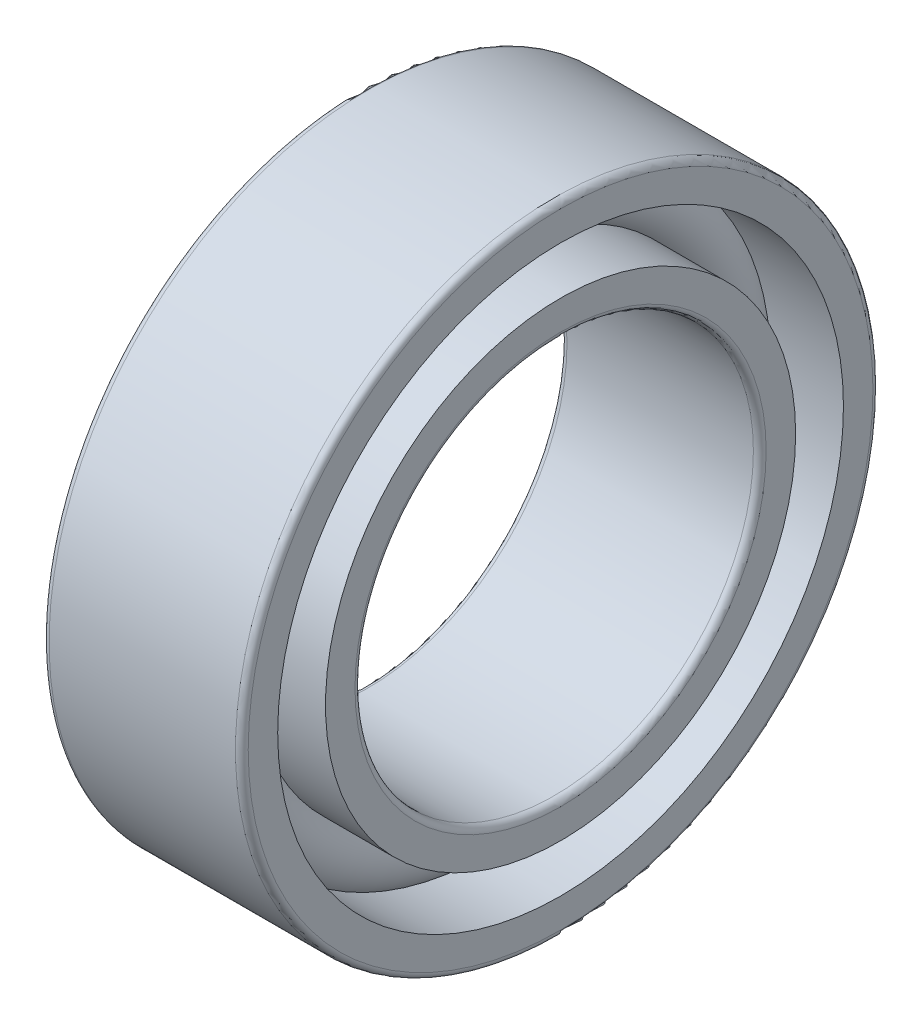
ISO-10303-21;
HEADER;
FILE_DESCRIPTION(('STEP AP214'),'2;1');
FILE_NAME('part.step','',(''),(''),'','','');
FILE_SCHEMA(('AUTOMOTIVE_DESIGN { 1 0 10303 214 1 1 1 1 }'));
ENDSEC;
DATA;
#1=APPLICATION_CONTEXT('core data for automotive mechanical design processes');
#2=APPLICATION_PROTOCOL_DEFINITION('international standard','automotive_design',2000,#1);
#3=PRODUCT_CONTEXT('',#1,'mechanical');
#4=PRODUCT('Part','Part','',(#3));
#5=PRODUCT_RELATED_PRODUCT_CATEGORY('part','',(#4));
#6=PRODUCT_DEFINITION_FORMATION('','',#4);
#7=PRODUCT_DEFINITION_CONTEXT('part definition',#1,'design');
#8=PRODUCT_DEFINITION('design','',#6,#7);
#9=PRODUCT_DEFINITION_SHAPE('','',#8);
#10=(LENGTH_UNIT() NAMED_UNIT(*) SI_UNIT(.MILLI.,.METRE.));
#11=(NAMED_UNIT(*) PLANE_ANGLE_UNIT() SI_UNIT($,.RADIAN.));
#12=(NAMED_UNIT(*) SI_UNIT($,.STERADIAN.) SOLID_ANGLE_UNIT());
#13=UNCERTAINTY_MEASURE_WITH_UNIT(LENGTH_MEASURE(1.E-05),#10,'distance_accuracy_value','');
#14=(GEOMETRIC_REPRESENTATION_CONTEXT(3) GLOBAL_UNCERTAINTY_ASSIGNED_CONTEXT((#13)) GLOBAL_UNIT_ASSIGNED_CONTEXT((#10,
#11,#12)) REPRESENTATION_CONTEXT('',''));
#15=CARTESIAN_POINT('',(0.,0.,0.));
#16=DIRECTION('',(0.,0.,1.));
#17=DIRECTION('',(1.,0.,0.));
#18=AXIS2_PLACEMENT_3D('',#15,#16,#17);
#19=CARTESIAN_POINT('',(0.,0.,0.));
#20=DIRECTION('',(-1.,0.,0.));
#21=DIRECTION('',(0.,0.,1.));
#22=AXIS2_PLACEMENT_3D('',#19,#20,#21);
#23=TOROIDAL_SURFACE('',#22,5.159375,0.714375);
#24=CARTESIAN_POINT('',(0.532463687142134,0.,0.));
#25=DIRECTION('',(-1.,0.,0.));
#26=DIRECTION('',(0.,0.,1.));
#27=AXIS2_PLACEMENT_3D('',#24,#25,#26);
#28=CIRCLE('',#27,5.635625);
#29=CARTESIAN_POINT('',(0.532463687142134,0.,5.635625));
#30=VERTEX_POINT('',#29);
#31=EDGE_CURVE('E35',#30,#30,#28,.F.);
#32=ORIENTED_EDGE('',*,*,#31,.T.);
#33=EDGE_LOOP('',(#32));
#34=FACE_BOUND('',#33,.T.);
#35=CARTESIAN_POINT('',(0.532463687142137,0.,0.));
#36=DIRECTION('',(-1.,0.,0.));
#37=DIRECTION('',(0.,0.,1.));
#38=AXIS2_PLACEMENT_3D('',#35,#36,#37);
#39=CIRCLE('',#38,4.683125);
#40=CARTESIAN_POINT('',(0.532463687142137,0.,4.683125));
#41=VERTEX_POINT('',#40);
#42=EDGE_CURVE('E10',#41,#41,#39,.T.);
#43=ORIENTED_EDGE('',*,*,#42,.T.);
#44=EDGE_LOOP('',(#43));
#45=FACE_BOUND('',#44,.T.);
#46=ADVANCED_FACE('F31',(#34,#45),#23,.T.);
#47=CARTESIAN_POINT('',(-20.6375,0.,0.));
#48=DIRECTION('',(1.,0.,0.));
#49=DIRECTION('',(0.,0.,-1.));
#50=AXIS2_PLACEMENT_3D('',#47,#48,#49);
#51=CYLINDRICAL_SURFACE('',#50,4.683125);
#52=CARTESIAN_POINT('',(1.98374,0.,0.));
#53=DIRECTION('',(1.,0.,0.));
#54=DIRECTION('',(0.,0.,-1.));
#55=AXIS2_PLACEMENT_3D('',#52,#53,#54);
#56=CIRCLE('',#55,4.683125);
#57=CARTESIAN_POINT('',(1.98374,0.,-4.683125));
#58=VERTEX_POINT('',#57);
#59=EDGE_CURVE('E44',#58,#58,#56,.T.);
#60=ORIENTED_EDGE('',*,*,#59,.F.);
#61=EDGE_LOOP('',(#60));
#62=FACE_BOUND('',#61,.T.);
#63=ORIENTED_EDGE('',*,*,#42,.F.);
#64=EDGE_LOOP('',(#63));
#65=FACE_BOUND('',#64,.T.);
#66=ADVANCED_FACE('F83',(#62,#65),#51,.T.);
#67=CARTESIAN_POINT('',(-20.6375,0.,0.));
#68=DIRECTION('',(1.,0.,0.));
#69=DIRECTION('',(0.,0.,-1.));
#70=AXIS2_PLACEMENT_3D('',#67,#68,#69);
#71=CYLINDRICAL_SURFACE('',#70,4.683125);
#72=CARTESIAN_POINT('',(-1.98374,0.,0.));
#73=DIRECTION('',(1.,0.,0.));
#74=DIRECTION('',(0.,0.,-1.));
#75=AXIS2_PLACEMENT_3D('',#72,#73,#74);
#76=CIRCLE('',#75,4.683125);
#77=CARTESIAN_POINT('',(-1.98374,0.,-4.683125));
#78=VERTEX_POINT('',#77);
#79=EDGE_CURVE('E53',#78,#78,#76,.T.);
#80=ORIENTED_EDGE('',*,*,#79,.T.);
#81=EDGE_LOOP('',(#80));
#82=FACE_BOUND('',#81,.T.);
#83=CARTESIAN_POINT('',(-0.532463687142137,0.,0.));
#84=DIRECTION('',(1.,0.,0.));
#85=DIRECTION('',(0.,0.,-1.));
#86=AXIS2_PLACEMENT_3D('',#83,#84,#85);
#87=CIRCLE('',#86,4.683125);
#88=CARTESIAN_POINT('',(-0.532463687142137,0.,-4.683125));
#89=VERTEX_POINT('',#88);
#90=EDGE_CURVE('E39',#89,#89,#87,.T.);
#91=ORIENTED_EDGE('',*,*,#90,.F.);
#92=EDGE_LOOP('',(#91));
#93=FACE_BOUND('',#92,.T.);
#94=ADVANCED_FACE('F86',(#82,#93),#71,.T.);
#95=CARTESIAN_POINT('',(1.98374,4.09575,0.));
#96=DIRECTION('',(1.,0.,0.));
#97=DIRECTION('',(0.,0.,-1.));
#98=AXIS2_PLACEMENT_3D('',#95,#96,#97);
#99=PLANE('',#98);
#100=ORIENTED_EDGE('',*,*,#59,.T.);
#101=EDGE_LOOP('',(#100));
#102=FACE_BOUND('',#101,.T.);
#103=CARTESIAN_POINT('',(1.98374,0.,0.));
#104=DIRECTION('',(1.,0.,0.));
#105=DIRECTION('',(0.,0.,-1.));
#106=AXIS2_PLACEMENT_3D('',#103,#104,#105);
#107=CIRCLE('',#106,4.09575);
#108=CARTESIAN_POINT('',(1.98374,0.,-4.09575));
#109=VERTEX_POINT('',#108);
#110=EDGE_CURVE('E75',#109,#109,#107,.T.);
#111=ORIENTED_EDGE('',*,*,#110,.F.);
#112=EDGE_LOOP('',(#111));
#113=FACE_BOUND('',#112,.T.);
#114=ADVANCED_FACE('F80',(#102,#113),#99,.T.);
#115=CARTESIAN_POINT('',(1.85674,0.,0.));
#116=DIRECTION('',(1.,0.,0.));
#117=DIRECTION('',(0.,0.,-1.));
#118=AXIS2_PLACEMENT_3D('',#115,#116,#117);
#119=TOROIDAL_SURFACE('',#118,4.09575,0.127);
#120=ORIENTED_EDGE('',*,*,#110,.T.);
#121=EDGE_LOOP('',(#120));
#122=FACE_BOUND('',#121,.T.);
#123=CARTESIAN_POINT('',(1.85674,0.,0.));
#124=DIRECTION('',(1.,0.,0.));
#125=DIRECTION('',(0.,0.,-1.));
#126=AXIS2_PLACEMENT_3D('',#123,#124,#125);
#127=CIRCLE('',#126,3.96875);
#128=CARTESIAN_POINT('',(1.85674,0.,-3.96875));
#129=VERTEX_POINT('',#128);
#130=EDGE_CURVE('E72',#129,#129,#127,.T.);
#131=ORIENTED_EDGE('',*,*,#130,.F.);
#132=EDGE_LOOP('',(#131));
#133=FACE_BOUND('',#132,.T.);
#134=ADVANCED_FACE('F97',(#122,#133),#119,.T.);
#135=CARTESIAN_POINT('',(-20.6375,0.,0.));
#136=DIRECTION('',(1.,0.,0.));
#137=DIRECTION('',(0.,0.,-1.));
#138=AXIS2_PLACEMENT_3D('',#135,#136,#137);
#139=CYLINDRICAL_SURFACE('',#138,3.96875);
#140=ORIENTED_EDGE('',*,*,#130,.T.);
#141=EDGE_LOOP('',(#140));
#142=FACE_BOUND('',#141,.T.);
#143=CARTESIAN_POINT('',(-1.85674,0.,0.));
#144=DIRECTION('',(1.,0.,0.));
#145=DIRECTION('',(0.,0.,-1.));
#146=AXIS2_PLACEMENT_3D('',#143,#144,#145);
#147=CIRCLE('',#146,3.96875);
#148=CARTESIAN_POINT('',(-1.85674,0.,-3.96875));
#149=VERTEX_POINT('',#148);
#150=EDGE_CURVE('E69',#149,#149,#147,.T.);
#151=ORIENTED_EDGE('',*,*,#150,.F.);
#152=EDGE_LOOP('',(#151));
#153=FACE_BOUND('',#152,.T.);
#154=ADVANCED_FACE('F100',(#142,#153),#139,.F.);
#155=CARTESIAN_POINT('',(-1.85674,0.,0.));
#156=DIRECTION('',(1.,0.,0.));
#157=DIRECTION('',(0.,0.,-1.));
#158=AXIS2_PLACEMENT_3D('',#155,#156,#157);
#159=TOROIDAL_SURFACE('',#158,4.09575,0.127);
#160=ORIENTED_EDGE('',*,*,#150,.T.);
#161=EDGE_LOOP('',(#160));
#162=FACE_BOUND('',#161,.T.);
#163=CARTESIAN_POINT('',(-1.98374,0.,0.));
#164=DIRECTION('',(1.,0.,0.));
#165=DIRECTION('',(0.,0.,-1.));
#166=AXIS2_PLACEMENT_3D('',#163,#164,#165);
#167=CIRCLE('',#166,4.09575);
#168=CARTESIAN_POINT('',(-1.98374,0.,-4.09575));
#169=VERTEX_POINT('',#168);
#170=EDGE_CURVE('E66',#169,#169,#167,.T.);
#171=ORIENTED_EDGE('',*,*,#170,.F.);
#172=EDGE_LOOP('',(#171));
#173=FACE_BOUND('',#172,.T.);
#174=ADVANCED_FACE('F104',(#162,#173),#159,.T.);
#175=CARTESIAN_POINT('',(-1.98374,4.683125,0.));
#176=DIRECTION('',(-1.,0.,0.));
#177=DIRECTION('',(0.,0.,1.));
#178=AXIS2_PLACEMENT_3D('',#175,#176,#177);
#179=PLANE('',#178);
#180=ORIENTED_EDGE('',*,*,#170,.T.);
#181=EDGE_LOOP('',(#180));
#182=FACE_BOUND('',#181,.T.);
#183=ORIENTED_EDGE('',*,*,#79,.F.);
#184=EDGE_LOOP('',(#183));
#185=FACE_BOUND('',#184,.T.);
#186=ADVANCED_FACE('F108',(#182,#185),#179,.T.);
#187=CARTESIAN_POINT('',(-0.532463687142134,0.,0.));
#188=DIRECTION('',(1.,0.,0.));
#189=DIRECTION('',(0.,0.,-1.));
#190=AXIS2_PLACEMENT_3D('',#187,#188,#189);
#191=CIRCLE('',#190,5.635625);
#192=CARTESIAN_POINT('',(-0.532463687142134,0.,-5.635625));
#193=VERTEX_POINT('',#192);
#194=EDGE_CURVE('E47',#193,#193,#191,.F.);
#195=ORIENTED_EDGE('',*,*,#194,.T.);
#196=EDGE_LOOP('',(#195));
#197=FACE_BOUND('',#196,.T.);
#198=ORIENTED_EDGE('',*,*,#90,.T.);
#199=EDGE_LOOP('',(#198));
#200=FACE_BOUND('',#199,.T.);
#201=ADVANCED_FACE('F33',(#197,#200),#23,.T.);
#202=CARTESIAN_POINT('',(-20.6375,0.,0.));
#203=DIRECTION('',(1.,0.,0.));
#204=DIRECTION('',(0.,0.,-1.));
#205=AXIS2_PLACEMENT_3D('',#202,#203,#204);
#206=CYLINDRICAL_SURFACE('',#205,5.635625);
#207=CARTESIAN_POINT('',(1.98374,0.,0.));
#208=DIRECTION('',(1.,0.,0.));
#209=DIRECTION('',(0.,0.,-1.));
#210=AXIS2_PLACEMENT_3D('',#207,#208,#209);
#211=CIRCLE('',#210,5.635625);
#212=CARTESIAN_POINT('',(1.98374,0.,-5.635625));
#213=VERTEX_POINT('',#212);
#214=EDGE_CURVE('E49',#213,#213,#211,.T.);
#215=ORIENTED_EDGE('',*,*,#214,.T.);
#216=EDGE_LOOP('',(#215));
#217=FACE_BOUND('',#216,.T.);
#218=ORIENTED_EDGE('',*,*,#31,.F.);
#219=EDGE_LOOP('',(#218));
#220=FACE_BOUND('',#219,.T.);
#221=ADVANCED_FACE('F113',(#217,#220),#206,.F.);
#222=CARTESIAN_POINT('',(-20.6375,0.,0.));
#223=DIRECTION('',(1.,0.,0.));
#224=DIRECTION('',(0.,0.,-1.));
#225=AXIS2_PLACEMENT_3D('',#222,#223,#224);
#226=CYLINDRICAL_SURFACE('',#225,5.635625);
#227=CARTESIAN_POINT('',(-1.98374,0.,0.));
#228=DIRECTION('',(1.,0.,0.));
#229=DIRECTION('',(0.,0.,-1.));
#230=AXIS2_PLACEMENT_3D('',#227,#228,#229);
#231=CIRCLE('',#230,5.635625);
#232=CARTESIAN_POINT('',(-1.98374,0.,-5.635625));
#233=VERTEX_POINT('',#232);
#234=EDGE_CURVE('E144',#233,#233,#231,.T.);
#235=ORIENTED_EDGE('',*,*,#234,.F.);
#236=EDGE_LOOP('',(#235));
#237=FACE_BOUND('',#236,.T.);
#238=ORIENTED_EDGE('',*,*,#194,.F.);
#239=EDGE_LOOP('',(#238));
#240=FACE_BOUND('',#239,.T.);
#241=ADVANCED_FACE('F116',(#237,#240),#226,.F.);
#242=CARTESIAN_POINT('',(1.98374,6.223,0.));
#243=DIRECTION('',(1.,0.,0.));
#244=DIRECTION('',(0.,0.,-1.));
#245=AXIS2_PLACEMENT_3D('',#242,#243,#244);
#246=PLANE('',#245);
#247=CARTESIAN_POINT('',(1.98374,0.,0.));
#248=DIRECTION('',(1.,0.,0.));
#249=DIRECTION('',(0.,0.,-1.));
#250=AXIS2_PLACEMENT_3D('',#247,#248,#249);
#251=CIRCLE('',#250,6.223);
#252=CARTESIAN_POINT('',(1.98374,0.,-6.223));
#253=VERTEX_POINT('',#252);
#254=EDGE_CURVE('E55',#253,#253,#251,.T.);
#255=ORIENTED_EDGE('',*,*,#254,.T.);
#256=EDGE_LOOP('',(#255));
#257=FACE_BOUND('',#256,.T.);
#258=ORIENTED_EDGE('',*,*,#214,.F.);
#259=EDGE_LOOP('',(#258));
#260=FACE_BOUND('',#259,.T.);
#261=ADVANCED_FACE('F117',(#257,#260),#246,.T.);
#262=CARTESIAN_POINT('',(1.85674,0.,0.));
#263=DIRECTION('',(1.,0.,0.));
#264=DIRECTION('',(0.,0.,-1.));
#265=AXIS2_PLACEMENT_3D('',#262,#263,#264);
#266=TOROIDAL_SURFACE('',#265,6.223,0.127);
#267=CARTESIAN_POINT('',(1.85674,0.,0.));
#268=DIRECTION('',(1.,0.,0.));
#269=DIRECTION('',(0.,0.,-1.));
#270=AXIS2_PLACEMENT_3D('',#267,#268,#269);
#271=CIRCLE('',#270,6.35);
#272=CARTESIAN_POINT('',(1.85674,0.,-6.35));
#273=VERTEX_POINT('',#272);
#274=EDGE_CURVE('E60',#273,#273,#271,.T.);
#275=ORIENTED_EDGE('',*,*,#274,.T.);
#276=EDGE_LOOP('',(#275));
#277=FACE_BOUND('',#276,.T.);
#278=ORIENTED_EDGE('',*,*,#254,.F.);
#279=EDGE_LOOP('',(#278));
#280=FACE_BOUND('',#279,.T.);
#281=ADVANCED_FACE('F120',(#277,#280),#266,.T.);
#282=CARTESIAN_POINT('',(-20.6375,0.,0.));
#283=DIRECTION('',(1.,0.,0.));
#284=DIRECTION('',(0.,0.,-1.));
#285=AXIS2_PLACEMENT_3D('',#282,#283,#284);
#286=CYLINDRICAL_SURFACE('',#285,6.35);
#287=CARTESIAN_POINT('',(-1.85674,0.,0.));
#288=DIRECTION('',(1.,0.,0.));
#289=DIRECTION('',(0.,0.,-1.));
#290=AXIS2_PLACEMENT_3D('',#287,#288,#289);
#291=CIRCLE('',#290,6.35);
#292=CARTESIAN_POINT('',(-1.85674,0.,-6.35));
#293=VERTEX_POINT('',#292);
#294=EDGE_CURVE('E148',#293,#293,#291,.T.);
#295=ORIENTED_EDGE('',*,*,#294,.T.);
#296=EDGE_LOOP('',(#295));
#297=FACE_BOUND('',#296,.T.);
#298=ORIENTED_EDGE('',*,*,#274,.F.);
#299=EDGE_LOOP('',(#298));
#300=FACE_BOUND('',#299,.T.);
#301=ADVANCED_FACE('F124',(#297,#300),#286,.T.);
#302=CARTESIAN_POINT('',(-1.85674,0.,0.));
#303=DIRECTION('',(1.,0.,0.));
#304=DIRECTION('',(0.,0.,-1.));
#305=AXIS2_PLACEMENT_3D('',#302,#303,#304);
#306=TOROIDAL_SURFACE('',#305,6.223,0.127);
#307=CARTESIAN_POINT('',(-1.98374,0.,0.));
#308=DIRECTION('',(1.,0.,0.));
#309=DIRECTION('',(0.,0.,-1.));
#310=AXIS2_PLACEMENT_3D('',#307,#308,#309);
#311=CIRCLE('',#310,6.223);
#312=CARTESIAN_POINT('',(-1.98374,0.,-6.223));
#313=VERTEX_POINT('',#312);
#314=EDGE_CURVE('E145',#313,#313,#311,.T.);
#315=ORIENTED_EDGE('',*,*,#314,.T.);
#316=EDGE_LOOP('',(#315));
#317=FACE_BOUND('',#316,.T.);
#318=ORIENTED_EDGE('',*,*,#294,.F.);
#319=EDGE_LOOP('',(#318));
#320=FACE_BOUND('',#319,.T.);
#321=ADVANCED_FACE('F128',(#317,#320),#306,.T.);
#322=CARTESIAN_POINT('',(-1.98374,5.635625,0.));
#323=DIRECTION('',(-1.,0.,0.));
#324=DIRECTION('',(0.,0.,1.));
#325=AXIS2_PLACEMENT_3D('',#322,#323,#324);
#326=PLANE('',#325);
#327=ORIENTED_EDGE('',*,*,#234,.T.);
#328=EDGE_LOOP('',(#327));
#329=FACE_BOUND('',#328,.T.);
#330=ORIENTED_EDGE('',*,*,#314,.F.);
#331=EDGE_LOOP('',(#330));
#332=FACE_BOUND('',#331,.T.);
#333=ADVANCED_FACE('F132',(#329,#332),#326,.T.);
#334=CLOSED_SHELL('',(#46,#66,#94,#114,#134,#154,#174,#186,#201,#221,#241,#261,#281,#301,#321,#333));
#335=MANIFOLD_SOLID_BREP('B2',#334);
#336=ADVANCED_BREP_SHAPE_REPRESENTATION('',(#18,#335),#14);
#337=SHAPE_DEFINITION_REPRESENTATION(#9,#336);
ENDSEC;
END-ISO-10303-21;
